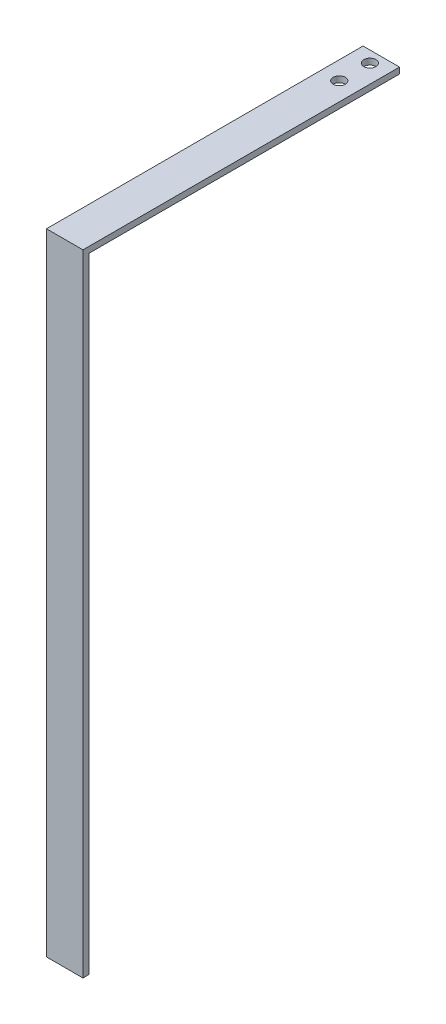
ISO-10303-21;
HEADER;
FILE_DESCRIPTION(('STEP AP214'),'2;1');
FILE_NAME('part.step','',(''),(''),'','','');
FILE_SCHEMA(('AUTOMOTIVE_DESIGN { 1 0 10303 214 1 1 1 1 }'));
ENDSEC;
DATA;
#1=APPLICATION_CONTEXT('core data for automotive mechanical design processes');
#2=APPLICATION_PROTOCOL_DEFINITION('international standard','automotive_design',2000,#1);
#3=PRODUCT_CONTEXT('',#1,'mechanical');
#4=PRODUCT('Part','Part','',(#3));
#5=PRODUCT_RELATED_PRODUCT_CATEGORY('part','',(#4));
#6=PRODUCT_DEFINITION_FORMATION('','',#4);
#7=PRODUCT_DEFINITION_CONTEXT('part definition',#1,'design');
#8=PRODUCT_DEFINITION('design','',#6,#7);
#9=PRODUCT_DEFINITION_SHAPE('','',#8);
#10=(LENGTH_UNIT() NAMED_UNIT(*) SI_UNIT(.MILLI.,.METRE.));
#11=(NAMED_UNIT(*) PLANE_ANGLE_UNIT() SI_UNIT($,.RADIAN.));
#12=(NAMED_UNIT(*) SI_UNIT($,.STERADIAN.) SOLID_ANGLE_UNIT());
#13=UNCERTAINTY_MEASURE_WITH_UNIT(LENGTH_MEASURE(1.E-05),#10,'distance_accuracy_value','');
#14=(GEOMETRIC_REPRESENTATION_CONTEXT(3) GLOBAL_UNCERTAINTY_ASSIGNED_CONTEXT((#13)) GLOBAL_UNIT_ASSIGNED_CONTEXT((#10,
#11,#12)) REPRESENTATION_CONTEXT('',''));
#15=CARTESIAN_POINT('',(0.,0.,0.));
#16=DIRECTION('',(0.,0.,1.));
#17=DIRECTION('',(1.,0.,0.));
#18=AXIS2_PLACEMENT_3D('',#15,#16,#17);
#19=CARTESIAN_POINT('',(-19.05,-3.155,330.7));
#20=DIRECTION('',(0.,1.,0.));
#21=DIRECTION('',(0.,0.,1.));
#22=AXIS2_PLACEMENT_3D('',#19,#20,#21);
#23=PLANE('',#22);
#24=CARTESIAN_POINT('',(-5.55111512312578E-12,-3.155,11.8922046657184));
#25=DIRECTION('',(0.,1.,0.));
#26=DIRECTION('',(0.,0.,1.));
#27=AXIS2_PLACEMENT_3D('',#24,#25,#26);
#28=CIRCLE('',#27,6.34999999999997);
#29=CARTESIAN_POINT('',(-5.55111512312578E-12,-3.155,18.2422046657184));
#30=VERTEX_POINT('',#29);
#31=EDGE_CURVE('E147',#30,#30,#28,.T.);
#32=ORIENTED_EDGE('',*,*,#31,.T.);
#33=EDGE_LOOP('',(#32));
#34=FACE_BOUND('',#33,.T.);
#35=CARTESIAN_POINT('',(-5.44009282066327E-12,-3.155,43.8922046657184));
#36=DIRECTION('',(0.,1.,0.));
#37=DIRECTION('',(0.,0.,1.));
#38=AXIS2_PLACEMENT_3D('',#35,#36,#37);
#39=CIRCLE('',#38,6.34999999999996);
#40=CARTESIAN_POINT('',(-5.44009282066327E-12,-3.155,50.2422046657184));
#41=VERTEX_POINT('',#40);
#42=EDGE_CURVE('E138',#41,#41,#39,.T.);
#43=ORIENTED_EDGE('',*,*,#42,.T.);
#44=EDGE_LOOP('',(#43));
#45=FACE_BOUND('',#44,.T.);
#46=DIRECTION('',(1.,0.,0.));
#47=VECTOR('',#46,1.);
#48=CARTESIAN_POINT('',(19.05,-3.155,324.39));
#49=LINE('',#48,#47);
#50=CARTESIAN_POINT('',(-19.05,-3.155,324.39));
#51=VERTEX_POINT('',#50);
#52=CARTESIAN_POINT('',(19.05,-3.155,324.39));
#53=VERTEX_POINT('',#52);
#54=EDGE_CURVE('E50',#51,#53,#49,.T.);
#55=ORIENTED_EDGE('',*,*,#54,.F.);
#56=DIRECTION('',(0.,0.,-1.));
#57=VECTOR('',#56,1.);
#58=CARTESIAN_POINT('',(-19.05,-3.155,330.7));
#59=LINE('',#58,#57);
#60=CARTESIAN_POINT('',(-19.05,-3.155,0.));
#61=VERTEX_POINT('',#60);
#62=EDGE_CURVE('E86',#51,#61,#59,.T.);
#63=ORIENTED_EDGE('',*,*,#62,.T.);
#64=DIRECTION('',(1.,0.,0.));
#65=VECTOR('',#64,1.);
#66=CARTESIAN_POINT('',(-19.05,-3.155,0.));
#67=LINE('',#66,#65);
#68=CARTESIAN_POINT('',(19.05,-3.155,0.));
#69=VERTEX_POINT('',#68);
#70=EDGE_CURVE('E90',#61,#69,#67,.T.);
#71=ORIENTED_EDGE('',*,*,#70,.T.);
#72=DIRECTION('',(0.,0.,-1.));
#73=VECTOR('',#72,1.);
#74=CARTESIAN_POINT('',(19.05,-3.155,330.7));
#75=LINE('',#74,#73);
#76=EDGE_CURVE('E77',#53,#69,#75,.T.);
#77=ORIENTED_EDGE('',*,*,#76,.F.);
#78=EDGE_LOOP('',(#55,#63,#71,#77));
#79=FACE_BOUND('',#78,.T.);
#80=ADVANCED_FACE('F35',(#34,#45,#79),#23,.F.);
#81=CARTESIAN_POINT('',(19.05,3.155,330.7));
#82=DIRECTION('',(-1.,0.,0.));
#83=DIRECTION('',(0.,0.,1.));
#84=AXIS2_PLACEMENT_3D('',#81,#82,#83);
#85=PLANE('',#84);
#86=DIRECTION('',(0.,1.,0.));
#87=VECTOR('',#86,1.);
#88=CARTESIAN_POINT('',(19.05,3.155,0.));
#89=LINE('',#88,#87);
#90=CARTESIAN_POINT('',(19.05,3.155,0.));
#91=VERTEX_POINT('',#90);
#92=EDGE_CURVE('E81',#69,#91,#89,.T.);
#93=ORIENTED_EDGE('',*,*,#92,.T.);
#94=DIRECTION('',(0.,0.,-1.));
#95=VECTOR('',#94,1.);
#96=CARTESIAN_POINT('',(19.05,3.155,330.7));
#97=LINE('',#96,#95);
#98=CARTESIAN_POINT('',(19.05,3.155,330.7));
#99=VERTEX_POINT('',#98);
#100=EDGE_CURVE('E11',#99,#91,#97,.T.);
#101=ORIENTED_EDGE('',*,*,#100,.F.);
#102=DIRECTION('',(0.,1.,0.));
#103=VECTOR('',#102,1.);
#104=CARTESIAN_POINT('',(19.05,3.155,330.7));
#105=LINE('',#104,#103);
#106=CARTESIAN_POINT('',(19.05,-655.635,330.7));
#107=VERTEX_POINT('',#106);
#108=EDGE_CURVE('E94',#107,#99,#105,.T.);
#109=ORIENTED_EDGE('',*,*,#108,.F.);
#110=DIRECTION('',(0.,0.,1.));
#111=VECTOR('',#110,1.);
#112=CARTESIAN_POINT('',(19.05,-655.635,324.39));
#113=LINE('',#112,#111);
#114=CARTESIAN_POINT('',(19.05,-655.635,324.39));
#115=VERTEX_POINT('',#114);
#116=EDGE_CURVE('E119',#115,#107,#113,.T.);
#117=ORIENTED_EDGE('',*,*,#116,.F.);
#118=DIRECTION('',(0.,1.,0.));
#119=VECTOR('',#118,1.);
#120=CARTESIAN_POINT('',(19.05,-655.635,324.39));
#121=LINE('',#120,#119);
#122=EDGE_CURVE('E85',#115,#53,#121,.T.);
#123=ORIENTED_EDGE('',*,*,#122,.T.);
#124=ORIENTED_EDGE('',*,*,#76,.T.);
#125=EDGE_LOOP('',(#93,#101,#109,#117,#123,#124));
#126=FACE_BOUND('',#125,.T.);
#127=ADVANCED_FACE('F37',(#126),#85,.F.);
#128=CARTESIAN_POINT('',(-19.05,3.155,330.7));
#129=DIRECTION('',(0.,-1.,0.));
#130=DIRECTION('',(0.,0.,-1.));
#131=AXIS2_PLACEMENT_3D('',#128,#129,#130);
#132=PLANE('',#131);
#133=CARTESIAN_POINT('',(-5.55111512312578E-12,3.155,11.8922046657184));
#134=DIRECTION('',(0.,1.,0.));
#135=DIRECTION('',(0.,0.,1.));
#136=AXIS2_PLACEMENT_3D('',#133,#134,#135);
#137=CIRCLE('',#136,6.34999999999997);
#138=CARTESIAN_POINT('',(-5.55111512312578E-12,3.155,18.2422046657184));
#139=VERTEX_POINT('',#138);
#140=EDGE_CURVE('E150',#139,#139,#137,.T.);
#141=ORIENTED_EDGE('',*,*,#140,.F.);
#142=EDGE_LOOP('',(#141));
#143=FACE_BOUND('',#142,.T.);
#144=CARTESIAN_POINT('',(-5.44009282066327E-12,3.155,43.8922046657184));
#145=DIRECTION('',(0.,1.,0.));
#146=DIRECTION('',(0.,0.,1.));
#147=AXIS2_PLACEMENT_3D('',#144,#145,#146);
#148=CIRCLE('',#147,6.34999999999996);
#149=CARTESIAN_POINT('',(-5.44009282066327E-12,3.155,50.2422046657184));
#150=VERTEX_POINT('',#149);
#151=EDGE_CURVE('E142',#150,#150,#148,.T.);
#152=ORIENTED_EDGE('',*,*,#151,.F.);
#153=EDGE_LOOP('',(#152));
#154=FACE_BOUND('',#153,.T.);
#155=DIRECTION('',(-1.,0.,0.));
#156=VECTOR('',#155,1.);
#157=CARTESIAN_POINT('',(-19.05,3.155,0.));
#158=LINE('',#157,#156);
#159=CARTESIAN_POINT('',(-19.05,3.155,0.));
#160=VERTEX_POINT('',#159);
#161=EDGE_CURVE('E98',#91,#160,#158,.T.);
#162=ORIENTED_EDGE('',*,*,#161,.T.);
#163=DIRECTION('',(0.,0.,-1.));
#164=VECTOR('',#163,1.);
#165=CARTESIAN_POINT('',(-19.05,3.155,330.7));
#166=LINE('',#165,#164);
#167=CARTESIAN_POINT('',(-19.05,3.155,330.7));
#168=VERTEX_POINT('',#167);
#169=EDGE_CURVE('E43',#168,#160,#166,.T.);
#170=ORIENTED_EDGE('',*,*,#169,.F.);
#171=DIRECTION('',(-1.,0.,0.));
#172=VECTOR('',#171,1.);
#173=CARTESIAN_POINT('',(-19.05,3.155,330.7));
#174=LINE('',#173,#172);
#175=EDGE_CURVE('E59',#99,#168,#174,.T.);
#176=ORIENTED_EDGE('',*,*,#175,.F.);
#177=ORIENTED_EDGE('',*,*,#100,.T.);
#178=EDGE_LOOP('',(#162,#170,#176,#177));
#179=FACE_BOUND('',#178,.T.);
#180=ADVANCED_FACE('F114',(#143,#154,#179),#132,.F.);
#181=CARTESIAN_POINT('',(-19.05,3.155,330.7));
#182=DIRECTION('',(1.,0.,0.));
#183=DIRECTION('',(0.,0.,-1.));
#184=AXIS2_PLACEMENT_3D('',#181,#182,#183);
#185=PLANE('',#184);
#186=DIRECTION('',(0.,-1.,0.));
#187=VECTOR('',#186,1.);
#188=CARTESIAN_POINT('',(-19.05,3.155,0.));
#189=LINE('',#188,#187);
#190=EDGE_CURVE('E95',#160,#61,#189,.T.);
#191=ORIENTED_EDGE('',*,*,#190,.T.);
#192=ORIENTED_EDGE('',*,*,#62,.F.);
#193=DIRECTION('',(0.,1.,0.));
#194=VECTOR('',#193,1.);
#195=CARTESIAN_POINT('',(-19.05,-655.635,324.39));
#196=LINE('',#195,#194);
#197=CARTESIAN_POINT('',(-19.05,-655.635,324.39));
#198=VERTEX_POINT('',#197);
#199=EDGE_CURVE('E99',#198,#51,#196,.T.);
#200=ORIENTED_EDGE('',*,*,#199,.F.);
#201=DIRECTION('',(0.,0.,-1.));
#202=VECTOR('',#201,1.);
#203=CARTESIAN_POINT('',(-19.05,-655.635,324.39));
#204=LINE('',#203,#202);
#205=CARTESIAN_POINT('',(-19.05,-655.635,330.7));
#206=VERTEX_POINT('',#205);
#207=EDGE_CURVE('E137',#206,#198,#204,.T.);
#208=ORIENTED_EDGE('',*,*,#207,.F.);
#209=DIRECTION('',(0.,-1.,0.));
#210=VECTOR('',#209,1.);
#211=CARTESIAN_POINT('',(-19.05,3.155,330.7));
#212=LINE('',#211,#210);
#213=EDGE_CURVE('E87',#168,#206,#212,.T.);
#214=ORIENTED_EDGE('',*,*,#213,.F.);
#215=ORIENTED_EDGE('',*,*,#169,.T.);
#216=EDGE_LOOP('',(#191,#192,#200,#208,#214,#215));
#217=FACE_BOUND('',#216,.T.);
#218=ADVANCED_FACE('F111',(#217),#185,.F.);
#219=CARTESIAN_POINT('',(0.,0.,330.7));
#220=DIRECTION('',(0.,0.,1.));
#221=DIRECTION('',(1.,0.,0.));
#222=AXIS2_PLACEMENT_3D('',#219,#220,#221);
#223=PLANE('',#222);
#224=ORIENTED_EDGE('',*,*,#108,.T.);
#225=ORIENTED_EDGE('',*,*,#175,.T.);
#226=ORIENTED_EDGE('',*,*,#213,.T.);
#227=DIRECTION('',(-1.,0.,0.));
#228=VECTOR('',#227,1.);
#229=CARTESIAN_POINT('',(19.05,-655.635,330.7));
#230=LINE('',#229,#228);
#231=EDGE_CURVE('E128',#107,#206,#230,.T.);
#232=ORIENTED_EDGE('',*,*,#231,.F.);
#233=EDGE_LOOP('',(#224,#225,#226,#232));
#234=FACE_BOUND('',#233,.T.);
#235=ADVANCED_FACE('F132',(#234),#223,.T.);
#236=CARTESIAN_POINT('',(0.,0.,0.));
#237=DIRECTION('',(0.,0.,1.));
#238=DIRECTION('',(1.,0.,0.));
#239=AXIS2_PLACEMENT_3D('',#236,#237,#238);
#240=PLANE('',#239);
#241=ORIENTED_EDGE('',*,*,#92,.F.);
#242=ORIENTED_EDGE('',*,*,#70,.F.);
#243=ORIENTED_EDGE('',*,*,#190,.F.);
#244=ORIENTED_EDGE('',*,*,#161,.F.);
#245=EDGE_LOOP('',(#241,#242,#243,#244));
#246=FACE_BOUND('',#245,.T.);
#247=ADVANCED_FACE('F97',(#246),#240,.F.);
#248=CARTESIAN_POINT('',(19.05,-655.635,324.39));
#249=DIRECTION('',(0.,0.,1.));
#250=DIRECTION('',(1.,0.,0.));
#251=AXIS2_PLACEMENT_3D('',#248,#249,#250);
#252=PLANE('',#251);
#253=ORIENTED_EDGE('',*,*,#54,.T.);
#254=ORIENTED_EDGE('',*,*,#122,.F.);
#255=DIRECTION('',(1.,0.,0.));
#256=VECTOR('',#255,1.);
#257=CARTESIAN_POINT('',(19.05,-655.635,324.39));
#258=LINE('',#257,#256);
#259=EDGE_CURVE('E130',#198,#115,#258,.T.);
#260=ORIENTED_EDGE('',*,*,#259,.F.);
#261=ORIENTED_EDGE('',*,*,#199,.T.);
#262=EDGE_LOOP('',(#253,#254,#260,#261));
#263=FACE_BOUND('',#262,.T.);
#264=ADVANCED_FACE('F174',(#263),#252,.F.);
#265=CARTESIAN_POINT('',(0.,-655.635,0.));
#266=DIRECTION('',(0.,-1.,0.));
#267=DIRECTION('',(0.,0.,-1.));
#268=AXIS2_PLACEMENT_3D('',#265,#266,#267);
#269=PLANE('',#268);
#270=ORIENTED_EDGE('',*,*,#207,.T.);
#271=ORIENTED_EDGE('',*,*,#259,.T.);
#272=ORIENTED_EDGE('',*,*,#116,.T.);
#273=ORIENTED_EDGE('',*,*,#231,.T.);
#274=EDGE_LOOP('',(#270,#271,#272,#273));
#275=FACE_BOUND('',#274,.T.);
#276=ADVANCED_FACE('F127',(#275),#269,.T.);
#277=CARTESIAN_POINT('',(-5.44009282066327E-12,-3.155,43.8922046657184));
#278=DIRECTION('',(0.,1.,0.));
#279=DIRECTION('',(0.,0.,1.));
#280=AXIS2_PLACEMENT_3D('',#277,#278,#279);
#281=CYLINDRICAL_SURFACE('',#280,6.34999999999996);
#282=ORIENTED_EDGE('',*,*,#42,.F.);
#283=EDGE_LOOP('',(#282));
#284=FACE_BOUND('',#283,.T.);
#285=ORIENTED_EDGE('',*,*,#151,.T.);
#286=EDGE_LOOP('',(#285));
#287=FACE_BOUND('',#286,.T.);
#288=ADVANCED_FACE('F160',(#284,#287),#281,.F.);
#289=CARTESIAN_POINT('',(-5.55111512312578E-12,-3.155,11.8922046657184));
#290=DIRECTION('',(0.,1.,0.));
#291=DIRECTION('',(0.,0.,1.));
#292=AXIS2_PLACEMENT_3D('',#289,#290,#291);
#293=CYLINDRICAL_SURFACE('',#292,6.34999999999997);
#294=ORIENTED_EDGE('',*,*,#31,.F.);
#295=EDGE_LOOP('',(#294));
#296=FACE_BOUND('',#295,.T.);
#297=ORIENTED_EDGE('',*,*,#140,.T.);
#298=EDGE_LOOP('',(#297));
#299=FACE_BOUND('',#298,.T.);
#300=ADVANCED_FACE('F157',(#296,#299),#293,.F.);
#301=CLOSED_SHELL('',(#80,#127,#180,#218,#235,#247,#264,#276,#288,#300));
#302=MANIFOLD_SOLID_BREP('B2',#301);
#303=ADVANCED_BREP_SHAPE_REPRESENTATION('',(#18,#302),#14);
#304=SHAPE_DEFINITION_REPRESENTATION(#9,#303);
ENDSEC;
END-ISO-10303-21;
